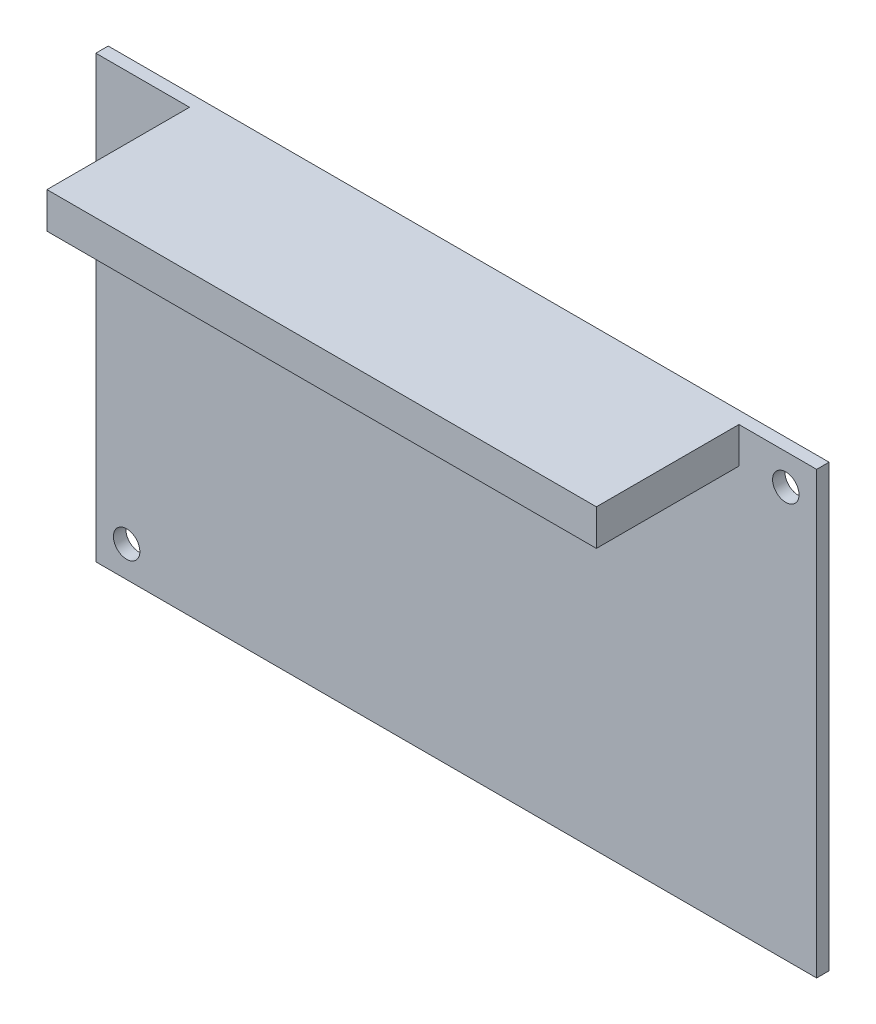
ISO-10303-21;
HEADER;
FILE_DESCRIPTION(('STEP AP214'),'2;1');
FILE_NAME('part.step','',(''),(''),'','','');
FILE_SCHEMA(('AUTOMOTIVE_DESIGN { 1 0 10303 214 1 1 1 1 }'));
ENDSEC;
DATA;
#1=APPLICATION_CONTEXT('core data for automotive mechanical design processes');
#2=APPLICATION_PROTOCOL_DEFINITION('international standard','automotive_design',2000,#1);
#3=PRODUCT_CONTEXT('',#1,'mechanical');
#4=PRODUCT('Part','Part','',(#3));
#5=PRODUCT_RELATED_PRODUCT_CATEGORY('part','',(#4));
#6=PRODUCT_DEFINITION_FORMATION('','',#4);
#7=PRODUCT_DEFINITION_CONTEXT('part definition',#1,'design');
#8=PRODUCT_DEFINITION('design','',#6,#7);
#9=PRODUCT_DEFINITION_SHAPE('','',#8);
#10=(LENGTH_UNIT() NAMED_UNIT(*) SI_UNIT(.MILLI.,.METRE.));
#11=(NAMED_UNIT(*) PLANE_ANGLE_UNIT() SI_UNIT($,.RADIAN.));
#12=(NAMED_UNIT(*) SI_UNIT($,.STERADIAN.) SOLID_ANGLE_UNIT());
#13=UNCERTAINTY_MEASURE_WITH_UNIT(LENGTH_MEASURE(1.E-05),#10,'distance_accuracy_value','');
#14=(GEOMETRIC_REPRESENTATION_CONTEXT(3) GLOBAL_UNCERTAINTY_ASSIGNED_CONTEXT((#13)) GLOBAL_UNIT_ASSIGNED_CONTEXT((#10,
#11,#12)) REPRESENTATION_CONTEXT('',''));
#15=CARTESIAN_POINT('',(0.,0.,0.));
#16=DIRECTION('',(0.,0.,1.));
#17=DIRECTION('',(1.,0.,0.));
#18=AXIS2_PLACEMENT_3D('',#15,#16,#17);
#19=CARTESIAN_POINT('',(0.,0.,1.55));
#20=DIRECTION('',(0.,0.,1.));
#21=DIRECTION('',(1.,0.,0.));
#22=AXIS2_PLACEMENT_3D('',#19,#20,#21);
#23=PLANE('',#22);
#24=DIRECTION('',(0.,-1.,0.));
#25=VECTOR('',#24,1.);
#26=CARTESIAN_POINT('',(11.7,0.,1.55));
#27=LINE('',#26,#25);
#28=CARTESIAN_POINT('',(11.7,0.,1.55));
#29=VERTEX_POINT('',#28);
#30=CARTESIAN_POINT('',(11.7,-4.5,1.55));
#31=VERTEX_POINT('',#30);
#32=EDGE_CURVE('E60',#29,#31,#27,.T.);
#33=ORIENTED_EDGE('',*,*,#32,.F.);
#34=DIRECTION('',(-1.,0.,0.));
#35=VECTOR('',#34,1.);
#36=CARTESIAN_POINT('',(0.,0.,1.55));
#37=LINE('',#36,#35);
#38=CARTESIAN_POINT('',(0.,0.,1.55));
#39=VERTEX_POINT('',#38);
#40=EDGE_CURVE('E162',#29,#39,#37,.T.);
#41=ORIENTED_EDGE('',*,*,#40,.T.);
#42=DIRECTION('',(0.,-1.,0.));
#43=VECTOR('',#42,1.);
#44=CARTESIAN_POINT('',(0.,0.,1.55));
#45=LINE('',#44,#43);
#46=CARTESIAN_POINT('',(0.,-55.,1.55));
#47=VERTEX_POINT('',#46);
#48=EDGE_CURVE('E151',#39,#47,#45,.T.);
#49=ORIENTED_EDGE('',*,*,#48,.T.);
#50=DIRECTION('',(1.,0.,0.));
#51=VECTOR('',#50,1.);
#52=CARTESIAN_POINT('',(0.,-55.,1.55));
#53=LINE('',#52,#51);
#54=CARTESIAN_POINT('',(90.,-55.,1.55));
#55=VERTEX_POINT('',#54);
#56=EDGE_CURVE('E155',#47,#55,#53,.T.);
#57=ORIENTED_EDGE('',*,*,#56,.T.);
#58=DIRECTION('',(0.,1.,0.));
#59=VECTOR('',#58,1.);
#60=CARTESIAN_POINT('',(90.,0.,1.55));
#61=LINE('',#60,#59);
#62=CARTESIAN_POINT('',(90.,0.,1.55));
#63=VERTEX_POINT('',#62);
#64=EDGE_CURVE('E159',#55,#63,#61,.T.);
#65=ORIENTED_EDGE('',*,*,#64,.T.);
#66=CARTESIAN_POINT('',(80.3,0.,1.55));
#67=VERTEX_POINT('',#66);
#68=EDGE_CURVE('E163',#63,#67,#37,.T.);
#69=ORIENTED_EDGE('',*,*,#68,.T.);
#70=DIRECTION('',(0.,1.,0.));
#71=VECTOR('',#70,1.);
#72=CARTESIAN_POINT('',(80.3,0.,1.55));
#73=LINE('',#72,#71);
#74=CARTESIAN_POINT('',(80.3,-4.5,1.55));
#75=VERTEX_POINT('',#74);
#76=EDGE_CURVE('E124',#75,#67,#73,.T.);
#77=ORIENTED_EDGE('',*,*,#76,.F.);
#78=DIRECTION('',(1.,0.,0.));
#79=VECTOR('',#78,1.);
#80=CARTESIAN_POINT('',(11.7,-4.5,1.55));
#81=LINE('',#80,#79);
#82=EDGE_CURVE('E55',#31,#75,#81,.T.);
#83=ORIENTED_EDGE('',*,*,#82,.F.);
#84=EDGE_LOOP('',(#33,#41,#49,#57,#65,#69,#77,#83));
#85=FACE_BOUND('',#84,.T.);
#86=CARTESIAN_POINT('',(86.15,-3.85,1.55));
#87=DIRECTION('',(0.,0.,1.));
#88=DIRECTION('',(1.,0.,0.));
#89=AXIS2_PLACEMENT_3D('',#86,#87,#88);
#90=CIRCLE('',#89,1.65);
#91=CARTESIAN_POINT('',(84.5,-3.85,1.55));
#92=VERTEX_POINT('',#91);
#93=EDGE_CURVE('E143',#92,#92,#90,.T.);
#94=ORIENTED_EDGE('',*,*,#93,.F.);
#95=EDGE_LOOP('',(#94));
#96=FACE_BOUND('',#95,.T.);
#97=CARTESIAN_POINT('',(3.85000000000001,-51.15,1.55));
#98=DIRECTION('',(0.,0.,1.));
#99=DIRECTION('',(1.,0.,0.));
#100=AXIS2_PLACEMENT_3D('',#97,#98,#99);
#101=CIRCLE('',#100,1.65);
#102=CARTESIAN_POINT('',(2.20000000000001,-51.15,1.55));
#103=VERTEX_POINT('',#102);
#104=EDGE_CURVE('E133',#103,#103,#101,.T.);
#105=ORIENTED_EDGE('',*,*,#104,.F.);
#106=EDGE_LOOP('',(#105));
#107=FACE_BOUND('',#106,.T.);
#108=ADVANCED_FACE('F39',(#85,#96,#107),#23,.T.);
#109=CARTESIAN_POINT('',(0.,0.,0.));
#110=DIRECTION('',(0.,0.,1.));
#111=DIRECTION('',(1.,0.,0.));
#112=AXIS2_PLACEMENT_3D('',#109,#110,#111);
#113=PLANE('',#112);
#114=DIRECTION('',(0.,-1.,0.));
#115=VECTOR('',#114,1.);
#116=CARTESIAN_POINT('',(0.,0.,0.));
#117=LINE('',#116,#115);
#118=CARTESIAN_POINT('',(0.,0.,0.));
#119=VERTEX_POINT('',#118);
#120=CARTESIAN_POINT('',(0.,-55.,0.));
#121=VERTEX_POINT('',#120);
#122=EDGE_CURVE('E147',#119,#121,#117,.T.);
#123=ORIENTED_EDGE('',*,*,#122,.F.);
#124=DIRECTION('',(-1.,0.,0.));
#125=VECTOR('',#124,1.);
#126=CARTESIAN_POINT('',(0.,0.,0.));
#127=LINE('',#126,#125);
#128=CARTESIAN_POINT('',(90.,0.,0.));
#129=VERTEX_POINT('',#128);
#130=EDGE_CURVE('E156',#129,#119,#127,.T.);
#131=ORIENTED_EDGE('',*,*,#130,.F.);
#132=DIRECTION('',(0.,1.,0.));
#133=VECTOR('',#132,1.);
#134=CARTESIAN_POINT('',(90.,0.,0.));
#135=LINE('',#134,#133);
#136=CARTESIAN_POINT('',(90.,-55.,0.));
#137=VERTEX_POINT('',#136);
#138=EDGE_CURVE('E173',#137,#129,#135,.T.);
#139=ORIENTED_EDGE('',*,*,#138,.F.);
#140=DIRECTION('',(1.,0.,0.));
#141=VECTOR('',#140,1.);
#142=CARTESIAN_POINT('',(0.,-55.,0.));
#143=LINE('',#142,#141);
#144=EDGE_CURVE('E170',#121,#137,#143,.T.);
#145=ORIENTED_EDGE('',*,*,#144,.F.);
#146=EDGE_LOOP('',(#123,#131,#139,#145));
#147=FACE_BOUND('',#146,.T.);
#148=CARTESIAN_POINT('',(86.15,-3.85,0.));
#149=DIRECTION('',(0.,0.,1.));
#150=DIRECTION('',(1.,0.,0.));
#151=AXIS2_PLACEMENT_3D('',#148,#149,#150);
#152=CIRCLE('',#151,1.65);
#153=CARTESIAN_POINT('',(84.5,-3.85,0.));
#154=VERTEX_POINT('',#153);
#155=EDGE_CURVE('E141',#154,#154,#152,.T.);
#156=ORIENTED_EDGE('',*,*,#155,.T.);
#157=EDGE_LOOP('',(#156));
#158=FACE_BOUND('',#157,.T.);
#159=CARTESIAN_POINT('',(3.85000000000001,-51.15,0.));
#160=DIRECTION('',(0.,0.,1.));
#161=DIRECTION('',(1.,0.,0.));
#162=AXIS2_PLACEMENT_3D('',#159,#160,#161);
#163=CIRCLE('',#162,1.65);
#164=CARTESIAN_POINT('',(2.20000000000001,-51.15,0.));
#165=VERTEX_POINT('',#164);
#166=EDGE_CURVE('E128',#165,#165,#163,.T.);
#167=ORIENTED_EDGE('',*,*,#166,.T.);
#168=EDGE_LOOP('',(#167));
#169=FACE_BOUND('',#168,.T.);
#170=ADVANCED_FACE('F196',(#147,#158,#169),#113,.F.);
#171=CARTESIAN_POINT('',(0.,0.,1.55));
#172=DIRECTION('',(1.,0.,0.));
#173=DIRECTION('',(0.,1.,0.));
#174=AXIS2_PLACEMENT_3D('',#171,#172,#173);
#175=PLANE('',#174);
#176=ORIENTED_EDGE('',*,*,#122,.T.);
#177=DIRECTION('',(0.,0.,-1.));
#178=VECTOR('',#177,1.);
#179=CARTESIAN_POINT('',(0.,-55.,1.55));
#180=LINE('',#179,#178);
#181=EDGE_CURVE('E11',#47,#121,#180,.T.);
#182=ORIENTED_EDGE('',*,*,#181,.F.);
#183=ORIENTED_EDGE('',*,*,#48,.F.);
#184=DIRECTION('',(0.,0.,-1.));
#185=VECTOR('',#184,1.);
#186=CARTESIAN_POINT('',(0.,0.,1.55));
#187=LINE('',#186,#185);
#188=EDGE_CURVE('E166',#39,#119,#187,.T.);
#189=ORIENTED_EDGE('',*,*,#188,.T.);
#190=EDGE_LOOP('',(#176,#182,#183,#189));
#191=FACE_BOUND('',#190,.T.);
#192=ADVANCED_FACE('F41',(#191),#175,.F.);
#193=CARTESIAN_POINT('',(0.,-55.,1.55));
#194=DIRECTION('',(0.,1.,0.));
#195=DIRECTION('',(0.,0.,1.));
#196=AXIS2_PLACEMENT_3D('',#193,#194,#195);
#197=PLANE('',#196);
#198=ORIENTED_EDGE('',*,*,#144,.T.);
#199=DIRECTION('',(0.,0.,-1.));
#200=VECTOR('',#199,1.);
#201=CARTESIAN_POINT('',(90.,-55.,1.55));
#202=LINE('',#201,#200);
#203=EDGE_CURVE('E48',#55,#137,#202,.T.);
#204=ORIENTED_EDGE('',*,*,#203,.F.);
#205=ORIENTED_EDGE('',*,*,#56,.F.);
#206=ORIENTED_EDGE('',*,*,#181,.T.);
#207=EDGE_LOOP('',(#198,#204,#205,#206));
#208=FACE_BOUND('',#207,.T.);
#209=ADVANCED_FACE('F247',(#208),#197,.F.);
#210=CARTESIAN_POINT('',(90.,0.,1.55));
#211=DIRECTION('',(-1.,0.,0.));
#212=DIRECTION('',(0.,0.,1.));
#213=AXIS2_PLACEMENT_3D('',#210,#211,#212);
#214=PLANE('',#213);
#215=ORIENTED_EDGE('',*,*,#138,.T.);
#216=DIRECTION('',(0.,0.,-1.));
#217=VECTOR('',#216,1.);
#218=CARTESIAN_POINT('',(90.,0.,1.55));
#219=LINE('',#218,#217);
#220=EDGE_CURVE('E181',#63,#129,#219,.T.);
#221=ORIENTED_EDGE('',*,*,#220,.F.);
#222=ORIENTED_EDGE('',*,*,#64,.F.);
#223=ORIENTED_EDGE('',*,*,#203,.T.);
#224=EDGE_LOOP('',(#215,#221,#222,#223));
#225=FACE_BOUND('',#224,.T.);
#226=ADVANCED_FACE('F190',(#225),#214,.F.);
#227=CARTESIAN_POINT('',(0.,0.,1.55));
#228=DIRECTION('',(0.,-1.,0.));
#229=DIRECTION('',(0.,0.,-1.));
#230=AXIS2_PLACEMENT_3D('',#227,#228,#229);
#231=PLANE('',#230);
#232=ORIENTED_EDGE('',*,*,#130,.T.);
#233=ORIENTED_EDGE('',*,*,#188,.F.);
#234=ORIENTED_EDGE('',*,*,#40,.F.);
#235=DIRECTION('',(0.,0.,-1.));
#236=VECTOR('',#235,1.);
#237=CARTESIAN_POINT('',(11.7,0.,19.35));
#238=LINE('',#237,#236);
#239=CARTESIAN_POINT('',(11.7,0.,19.35));
#240=VERTEX_POINT('',#239);
#241=EDGE_CURVE('E207',#240,#29,#238,.T.);
#242=ORIENTED_EDGE('',*,*,#241,.F.);
#243=DIRECTION('',(-1.,0.,0.));
#244=VECTOR('',#243,1.);
#245=CARTESIAN_POINT('',(11.7,0.,19.35));
#246=LINE('',#245,#244);
#247=CARTESIAN_POINT('',(80.3,0.,19.35));
#248=VERTEX_POINT('',#247);
#249=EDGE_CURVE('E119',#248,#240,#246,.T.);
#250=ORIENTED_EDGE('',*,*,#249,.F.);
#251=DIRECTION('',(0.,0.,-1.));
#252=VECTOR('',#251,1.);
#253=CARTESIAN_POINT('',(80.3,0.,19.35));
#254=LINE('',#253,#252);
#255=EDGE_CURVE('E135',#248,#67,#254,.T.);
#256=ORIENTED_EDGE('',*,*,#255,.T.);
#257=ORIENTED_EDGE('',*,*,#68,.F.);
#258=ORIENTED_EDGE('',*,*,#220,.T.);
#259=EDGE_LOOP('',(#232,#233,#234,#242,#250,#256,#257,#258));
#260=FACE_BOUND('',#259,.T.);
#261=ADVANCED_FACE('F200',(#260),#231,.F.);
#262=CARTESIAN_POINT('',(86.15,-3.85,1.55));
#263=DIRECTION('',(0.,0.,-1.));
#264=DIRECTION('',(-1.,0.,0.));
#265=AXIS2_PLACEMENT_3D('',#262,#263,#264);
#266=CYLINDRICAL_SURFACE('',#265,1.65);
#267=CARTESIAN_POINT('',(84.5,-3.85,1.55));
#268=CARTESIAN_POINT('',(84.5,-3.85,1.53385416666667));
#269=CARTESIAN_POINT('',(84.5,-3.85,1.51770833333333));
#270=CARTESIAN_POINT('',(84.5,-3.85,1.48541666666667));
#271=CARTESIAN_POINT('',(84.5,-3.85,1.46927083333333));
#272=CARTESIAN_POINT('',(84.5,-3.85,1.43697916666667));
#273=CARTESIAN_POINT('',(84.5,-3.85,1.42083333333333));
#274=CARTESIAN_POINT('',(84.5,-3.85,1.38854166666667));
#275=CARTESIAN_POINT('',(84.5,-3.85,1.37239583333333));
#276=CARTESIAN_POINT('',(84.5,-3.85,1.34010416666667));
#277=CARTESIAN_POINT('',(84.5,-3.85,1.32395833333333));
#278=CARTESIAN_POINT('',(84.5,-3.85,1.29166666666667));
#279=CARTESIAN_POINT('',(84.5,-3.85,1.27552083333333));
#280=CARTESIAN_POINT('',(84.5,-3.85,1.24322916666667));
#281=CARTESIAN_POINT('',(84.5,-3.85,1.22708333333333));
#282=CARTESIAN_POINT('',(84.5,-3.85,1.19479166666667));
#283=CARTESIAN_POINT('',(84.5,-3.85,1.17864583333333));
#284=CARTESIAN_POINT('',(84.5,-3.85,1.14635416666667));
#285=CARTESIAN_POINT('',(84.5,-3.85,1.13020833333333));
#286=CARTESIAN_POINT('',(84.5,-3.85,1.09791666666667));
#287=CARTESIAN_POINT('',(84.5,-3.85,1.08177083333333));
#288=CARTESIAN_POINT('',(84.5,-3.85,1.04947916666667));
#289=CARTESIAN_POINT('',(84.5,-3.85,1.03333333333333));
#290=CARTESIAN_POINT('',(84.5,-3.85,1.00104166666667));
#291=CARTESIAN_POINT('',(84.5,-3.85,0.984895833333333));
#292=CARTESIAN_POINT('',(84.5,-3.85,0.952604166666667));
#293=CARTESIAN_POINT('',(84.5,-3.85,0.936458333333333));
#294=CARTESIAN_POINT('',(84.5,-3.85,0.904166666666667));
#295=CARTESIAN_POINT('',(84.5,-3.85,0.888020833333333));
#296=CARTESIAN_POINT('',(84.5,-3.85,0.855729166666667));
#297=CARTESIAN_POINT('',(84.5,-3.85,0.839583333333333));
#298=CARTESIAN_POINT('',(84.5,-3.85,0.807291666666667));
#299=CARTESIAN_POINT('',(84.5,-3.85,0.791145833333333));
#300=CARTESIAN_POINT('',(84.5,-3.85,0.758854166666667));
#301=CARTESIAN_POINT('',(84.5,-3.85,0.742708333333333));
#302=CARTESIAN_POINT('',(84.5,-3.85,0.710416666666667));
#303=CARTESIAN_POINT('',(84.5,-3.85,0.694270833333333));
#304=CARTESIAN_POINT('',(84.5,-3.85,0.661979166666667));
#305=CARTESIAN_POINT('',(84.5,-3.85,0.645833333333333));
#306=CARTESIAN_POINT('',(84.5,-3.85,0.613541666666667));
#307=CARTESIAN_POINT('',(84.5,-3.85,0.597395833333333));
#308=CARTESIAN_POINT('',(84.5,-3.85,0.565104166666667));
#309=CARTESIAN_POINT('',(84.5,-3.85,0.548958333333333));
#310=CARTESIAN_POINT('',(84.5,-3.85,0.516666666666667));
#311=CARTESIAN_POINT('',(84.5,-3.85,0.500520833333333));
#312=CARTESIAN_POINT('',(84.5,-3.85,0.468229166666667));
#313=CARTESIAN_POINT('',(84.5,-3.85,0.452083333333333));
#314=CARTESIAN_POINT('',(84.5,-3.85,0.419791666666667));
#315=CARTESIAN_POINT('',(84.5,-3.85,0.403645833333333));
#316=CARTESIAN_POINT('',(84.5,-3.85,0.371354166666667));
#317=CARTESIAN_POINT('',(84.5,-3.85,0.355208333333333));
#318=CARTESIAN_POINT('',(84.5,-3.85,0.322916666666667));
#319=CARTESIAN_POINT('',(84.5,-3.85,0.306770833333333));
#320=CARTESIAN_POINT('',(84.5,-3.85,0.274479166666667));
#321=CARTESIAN_POINT('',(84.5,-3.85,0.258333333333333));
#322=CARTESIAN_POINT('',(84.5,-3.85,0.226041666666667));
#323=CARTESIAN_POINT('',(84.5,-3.85,0.209895833333333));
#324=CARTESIAN_POINT('',(84.5,-3.85,0.177604166666667));
#325=CARTESIAN_POINT('',(84.5,-3.85,0.161458333333333));
#326=CARTESIAN_POINT('',(84.5,-3.85,0.129166666666667));
#327=CARTESIAN_POINT('',(84.5,-3.85,0.113020833333333));
#328=CARTESIAN_POINT('',(84.5,-3.85,0.0807291666666667));
#329=CARTESIAN_POINT('',(84.5,-3.85,0.0645833333333334));
#330=CARTESIAN_POINT('',(84.5,-3.85,0.0322916666666667));
#331=CARTESIAN_POINT('',(84.5,-3.85,0.0161458333333334));
#332=CARTESIAN_POINT('',(84.5,-3.85,0.));
#333=B_SPLINE_CURVE_WITH_KNOTS('',3,(#267,#268,#269,#270,#271,#272,#273,#274,#275,#276,#277,
#278,#279,#280,#281,#282,#283,#284,#285,#286,#287,#288,#289,#290,#291,#292,#293,#294,#295,#296,
#297,#298,#299,#300,#301,#302,#303,#304,#305,#306,#307,#308,#309,#310,#311,#312,#313,#314,#315,
#316,#317,#318,#319,#320,#321,#322,#323,#324,#325,#326,#327,#328,#329,#330,#331,#332),
.UNSPECIFIED.,.F.,.F.,(4,2,2,2,2,2,2,2,2,2,2,2,2,2,2,2,2,2,2,2,2,2,2,2,2,2,2,2,2,2,2,2,4),(0.,
0.0484375000000001,0.0968750000000002,0.1453125,0.19375,0.2421875,0.290625,0.3390625,0.3875,
0.4359375,0.484375,0.5328125,0.58125,0.6296875,0.678125,0.7265625,0.775,0.8234375,0.871875,
0.9203125,0.96875,1.0171875,1.065625,1.1140625,1.1625,1.2109375,1.259375,1.3078125,1.35625,
1.4046875,1.453125,1.5015625,1.55),.UNSPECIFIED.);
#334=EDGE_CURVE('BSEAM241',#92,#154,#333,.T.);
#335=ORIENTED_EDGE('',*,*,#93,.T.);
#336=ORIENTED_EDGE('',*,*,#155,.F.);
#337=ORIENTED_EDGE('',*,*,#334,.T.);
#338=ORIENTED_EDGE('',*,*,#334,.F.);
#339=EDGE_LOOP('',(#335,#337,#336,#338));
#340=FACE_BOUND('',#339,.T.);
#341=ADVANCED_FACE('F241',(#340),#266,.F.);
#342=CARTESIAN_POINT('',(3.85000000000001,-51.15,1.55));
#343=DIRECTION('',(0.,0.,-1.));
#344=DIRECTION('',(-1.,0.,0.));
#345=AXIS2_PLACEMENT_3D('',#342,#343,#344);
#346=CYLINDRICAL_SURFACE('',#345,1.65);
#347=CARTESIAN_POINT('',(2.20000000000001,-51.15,1.55));
#348=CARTESIAN_POINT('',(2.20000000000001,-51.15,1.53385416666667));
#349=CARTESIAN_POINT('',(2.20000000000001,-51.15,1.51770833333333));
#350=CARTESIAN_POINT('',(2.20000000000001,-51.15,1.48541666666667));
#351=CARTESIAN_POINT('',(2.20000000000001,-51.15,1.46927083333333));
#352=CARTESIAN_POINT('',(2.20000000000001,-51.15,1.43697916666667));
#353=CARTESIAN_POINT('',(2.20000000000001,-51.15,1.42083333333333));
#354=CARTESIAN_POINT('',(2.20000000000001,-51.15,1.38854166666667));
#355=CARTESIAN_POINT('',(2.20000000000001,-51.15,1.37239583333333));
#356=CARTESIAN_POINT('',(2.20000000000001,-51.15,1.34010416666667));
#357=CARTESIAN_POINT('',(2.20000000000001,-51.15,1.32395833333333));
#358=CARTESIAN_POINT('',(2.20000000000001,-51.15,1.29166666666667));
#359=CARTESIAN_POINT('',(2.20000000000001,-51.15,1.27552083333333));
#360=CARTESIAN_POINT('',(2.20000000000001,-51.15,1.24322916666667));
#361=CARTESIAN_POINT('',(2.20000000000001,-51.15,1.22708333333333));
#362=CARTESIAN_POINT('',(2.20000000000001,-51.15,1.19479166666667));
#363=CARTESIAN_POINT('',(2.20000000000001,-51.15,1.17864583333333));
#364=CARTESIAN_POINT('',(2.20000000000001,-51.15,1.14635416666667));
#365=CARTESIAN_POINT('',(2.20000000000001,-51.15,1.13020833333333));
#366=CARTESIAN_POINT('',(2.20000000000001,-51.15,1.09791666666667));
#367=CARTESIAN_POINT('',(2.20000000000001,-51.15,1.08177083333333));
#368=CARTESIAN_POINT('',(2.20000000000001,-51.15,1.04947916666667));
#369=CARTESIAN_POINT('',(2.20000000000001,-51.15,1.03333333333333));
#370=CARTESIAN_POINT('',(2.20000000000001,-51.15,1.00104166666667));
#371=CARTESIAN_POINT('',(2.20000000000001,-51.15,0.984895833333333));
#372=CARTESIAN_POINT('',(2.20000000000001,-51.15,0.952604166666667));
#373=CARTESIAN_POINT('',(2.20000000000001,-51.15,0.936458333333333));
#374=CARTESIAN_POINT('',(2.20000000000001,-51.15,0.904166666666667));
#375=CARTESIAN_POINT('',(2.20000000000001,-51.15,0.888020833333333));
#376=CARTESIAN_POINT('',(2.20000000000001,-51.15,0.855729166666667));
#377=CARTESIAN_POINT('',(2.20000000000001,-51.15,0.839583333333333));
#378=CARTESIAN_POINT('',(2.20000000000001,-51.15,0.807291666666667));
#379=CARTESIAN_POINT('',(2.20000000000001,-51.15,0.791145833333333));
#380=CARTESIAN_POINT('',(2.20000000000001,-51.15,0.758854166666667));
#381=CARTESIAN_POINT('',(2.20000000000001,-51.15,0.742708333333333));
#382=CARTESIAN_POINT('',(2.20000000000001,-51.15,0.710416666666667));
#383=CARTESIAN_POINT('',(2.20000000000001,-51.15,0.694270833333333));
#384=CARTESIAN_POINT('',(2.20000000000001,-51.15,0.661979166666667));
#385=CARTESIAN_POINT('',(2.20000000000001,-51.15,0.645833333333333));
#386=CARTESIAN_POINT('',(2.20000000000001,-51.15,0.613541666666667));
#387=CARTESIAN_POINT('',(2.20000000000001,-51.15,0.597395833333333));
#388=CARTESIAN_POINT('',(2.20000000000001,-51.15,0.565104166666667));
#389=CARTESIAN_POINT('',(2.20000000000001,-51.15,0.548958333333333));
#390=CARTESIAN_POINT('',(2.20000000000001,-51.15,0.516666666666667));
#391=CARTESIAN_POINT('',(2.20000000000001,-51.15,0.500520833333333));
#392=CARTESIAN_POINT('',(2.20000000000001,-51.15,0.468229166666667));
#393=CARTESIAN_POINT('',(2.20000000000001,-51.15,0.452083333333333));
#394=CARTESIAN_POINT('',(2.20000000000001,-51.15,0.419791666666667));
#395=CARTESIAN_POINT('',(2.20000000000001,-51.15,0.403645833333333));
#396=CARTESIAN_POINT('',(2.20000000000001,-51.15,0.371354166666667));
#397=CARTESIAN_POINT('',(2.20000000000001,-51.15,0.355208333333333));
#398=CARTESIAN_POINT('',(2.20000000000001,-51.15,0.322916666666667));
#399=CARTESIAN_POINT('',(2.20000000000001,-51.15,0.306770833333333));
#400=CARTESIAN_POINT('',(2.20000000000001,-51.15,0.274479166666667));
#401=CARTESIAN_POINT('',(2.20000000000001,-51.15,0.258333333333333));
#402=CARTESIAN_POINT('',(2.20000000000001,-51.15,0.226041666666667));
#403=CARTESIAN_POINT('',(2.20000000000001,-51.15,0.209895833333333));
#404=CARTESIAN_POINT('',(2.20000000000001,-51.15,0.177604166666667));
#405=CARTESIAN_POINT('',(2.20000000000001,-51.15,0.161458333333333));
#406=CARTESIAN_POINT('',(2.20000000000001,-51.15,0.129166666666667));
#407=CARTESIAN_POINT('',(2.20000000000001,-51.15,0.113020833333333));
#408=CARTESIAN_POINT('',(2.20000000000001,-51.15,0.0807291666666667));
#409=CARTESIAN_POINT('',(2.20000000000001,-51.15,0.0645833333333334));
#410=CARTESIAN_POINT('',(2.20000000000001,-51.15,0.0322916666666667));
#411=CARTESIAN_POINT('',(2.20000000000001,-51.15,0.0161458333333334));
#412=CARTESIAN_POINT('',(2.20000000000001,-51.15,0.));
#413=B_SPLINE_CURVE_WITH_KNOTS('',3,(#347,#348,#349,#350,#351,#352,#353,#354,#355,#356,#357,
#358,#359,#360,#361,#362,#363,#364,#365,#366,#367,#368,#369,#370,#371,#372,#373,#374,#375,#376,
#377,#378,#379,#380,#381,#382,#383,#384,#385,#386,#387,#388,#389,#390,#391,#392,#393,#394,#395,
#396,#397,#398,#399,#400,#401,#402,#403,#404,#405,#406,#407,#408,#409,#410,#411,#412),
.UNSPECIFIED.,.F.,.F.,(4,2,2,2,2,2,2,2,2,2,2,2,2,2,2,2,2,2,2,2,2,2,2,2,2,2,2,2,2,2,2,2,4),(0.,
0.0484375000000001,0.0968750000000002,0.1453125,0.19375,0.2421875,0.290625,0.3390625,0.3875,
0.4359375,0.484375,0.5328125,0.58125,0.6296875,0.678125,0.7265625,0.775,0.8234375,0.871875,
0.9203125,0.96875,1.0171875,1.065625,1.1140625,1.1625,1.2109375,1.259375,1.3078125,1.35625,
1.4046875,1.453125,1.5015625,1.55),.UNSPECIFIED.);
#414=EDGE_CURVE('BSEAM290',#103,#165,#413,.T.);
#415=ORIENTED_EDGE('',*,*,#104,.T.);
#416=ORIENTED_EDGE('',*,*,#166,.F.);
#417=ORIENTED_EDGE('',*,*,#414,.T.);
#418=ORIENTED_EDGE('',*,*,#414,.F.);
#419=EDGE_LOOP('',(#415,#417,#416,#418));
#420=FACE_BOUND('',#419,.T.);
#421=ADVANCED_FACE('F290',(#420),#346,.F.);
#422=CARTESIAN_POINT('',(11.7,0.,19.35));
#423=DIRECTION('',(1.,0.,0.));
#424=DIRECTION('',(0.,1.,0.));
#425=AXIS2_PLACEMENT_3D('',#422,#423,#424);
#426=PLANE('',#425);
#427=ORIENTED_EDGE('',*,*,#32,.T.);
#428=DIRECTION('',(0.,0.,-1.));
#429=VECTOR('',#428,1.);
#430=CARTESIAN_POINT('',(11.7,-4.5,19.35));
#431=LINE('',#430,#429);
#432=CARTESIAN_POINT('',(11.7,-4.5,19.35));
#433=VERTEX_POINT('',#432);
#434=EDGE_CURVE('E107',#433,#31,#431,.T.);
#435=ORIENTED_EDGE('',*,*,#434,.F.);
#436=DIRECTION('',(0.,-1.,0.));
#437=VECTOR('',#436,1.);
#438=CARTESIAN_POINT('',(11.7,0.,19.35));
#439=LINE('',#438,#437);
#440=EDGE_CURVE('E114',#240,#433,#439,.T.);
#441=ORIENTED_EDGE('',*,*,#440,.F.);
#442=ORIENTED_EDGE('',*,*,#241,.T.);
#443=EDGE_LOOP('',(#427,#435,#441,#442));
#444=FACE_BOUND('',#443,.T.);
#445=ADVANCED_FACE('F126',(#444),#426,.F.);
#446=CARTESIAN_POINT('',(11.7,-4.5,19.35));
#447=DIRECTION('',(0.,1.,0.));
#448=DIRECTION('',(0.,0.,1.));
#449=AXIS2_PLACEMENT_3D('',#446,#447,#448);
#450=PLANE('',#449);
#451=ORIENTED_EDGE('',*,*,#82,.T.);
#452=DIRECTION('',(0.,0.,-1.));
#453=VECTOR('',#452,1.);
#454=CARTESIAN_POINT('',(80.3,-4.5,19.35));
#455=LINE('',#454,#453);
#456=CARTESIAN_POINT('',(80.3,-4.5,19.35));
#457=VERTEX_POINT('',#456);
#458=EDGE_CURVE('E109',#457,#75,#455,.T.);
#459=ORIENTED_EDGE('',*,*,#458,.F.);
#460=DIRECTION('',(1.,0.,0.));
#461=VECTOR('',#460,1.);
#462=CARTESIAN_POINT('',(11.7,-4.5,19.35));
#463=LINE('',#462,#461);
#464=EDGE_CURVE('E103',#433,#457,#463,.T.);
#465=ORIENTED_EDGE('',*,*,#464,.F.);
#466=ORIENTED_EDGE('',*,*,#434,.T.);
#467=EDGE_LOOP('',(#451,#459,#465,#466));
#468=FACE_BOUND('',#467,.T.);
#469=ADVANCED_FACE('F105',(#468),#450,.F.);
#470=CARTESIAN_POINT('',(80.3,0.,19.35));
#471=DIRECTION('',(-1.,0.,0.));
#472=DIRECTION('',(0.,0.,1.));
#473=AXIS2_PLACEMENT_3D('',#470,#471,#472);
#474=PLANE('',#473);
#475=ORIENTED_EDGE('',*,*,#76,.T.);
#476=ORIENTED_EDGE('',*,*,#255,.F.);
#477=DIRECTION('',(0.,1.,0.));
#478=VECTOR('',#477,1.);
#479=CARTESIAN_POINT('',(80.3,0.,19.35));
#480=LINE('',#479,#478);
#481=EDGE_CURVE('E113',#457,#248,#480,.T.);
#482=ORIENTED_EDGE('',*,*,#481,.F.);
#483=ORIENTED_EDGE('',*,*,#458,.T.);
#484=EDGE_LOOP('',(#475,#476,#482,#483));
#485=FACE_BOUND('',#484,.T.);
#486=ADVANCED_FACE('F225',(#485),#474,.F.);
#487=CARTESIAN_POINT('',(0.,0.,19.35));
#488=DIRECTION('',(0.,0.,1.));
#489=DIRECTION('',(1.,0.,0.));
#490=AXIS2_PLACEMENT_3D('',#487,#488,#489);
#491=PLANE('',#490);
#492=ORIENTED_EDGE('',*,*,#440,.T.);
#493=ORIENTED_EDGE('',*,*,#464,.T.);
#494=ORIENTED_EDGE('',*,*,#481,.T.);
#495=ORIENTED_EDGE('',*,*,#249,.T.);
#496=EDGE_LOOP('',(#492,#493,#494,#495));
#497=FACE_BOUND('',#496,.T.);
#498=ADVANCED_FACE('F117',(#497),#491,.T.);
#499=CLOSED_SHELL('',(#108,#170,#192,#209,#226,#261,#341,#421,#445,#469,#486,#498));
#500=MANIFOLD_SOLID_BREP('B2',#499);
#501=ADVANCED_BREP_SHAPE_REPRESENTATION('',(#18,#500),#14);
#502=SHAPE_DEFINITION_REPRESENTATION(#9,#501);
ENDSEC;
END-ISO-10303-21;
